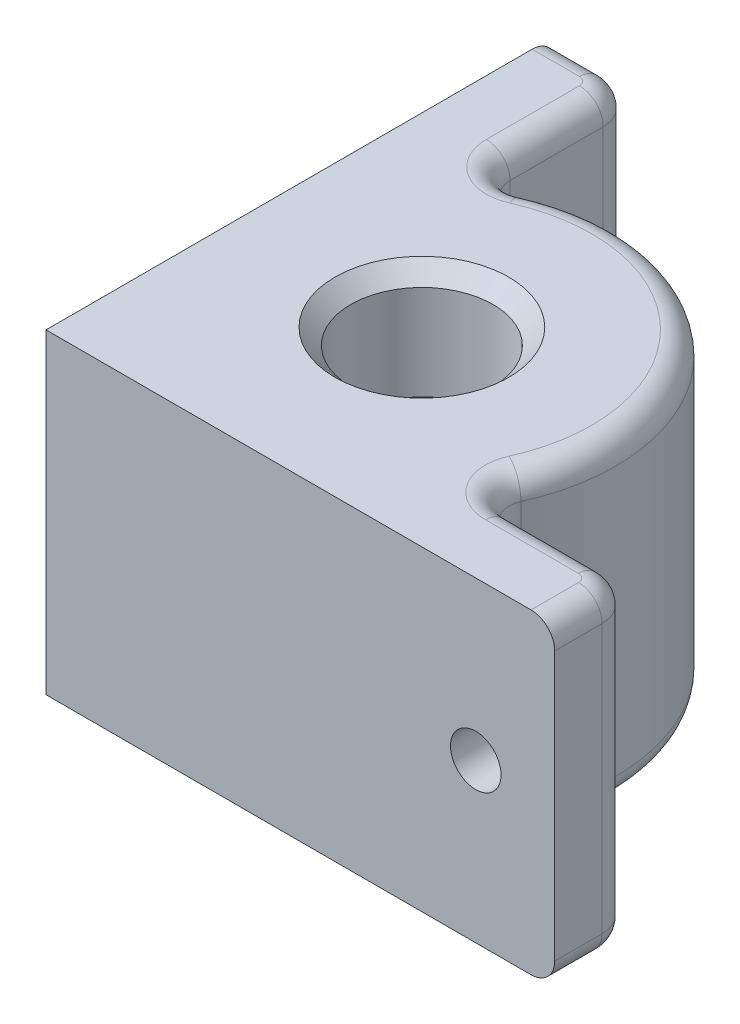
ISO-10303-21;
HEADER;
FILE_DESCRIPTION(('STEP AP214'),'2;1');
FILE_NAME('part.step','',(''),(''),'','','');
FILE_SCHEMA(('AUTOMOTIVE_DESIGN { 1 0 10303 214 1 1 1 1 }'));
ENDSEC;
DATA;
#1=APPLICATION_CONTEXT('core data for automotive mechanical design processes');
#2=APPLICATION_PROTOCOL_DEFINITION('international standard','automotive_design',2000,#1);
#3=PRODUCT_CONTEXT('',#1,'mechanical');
#4=PRODUCT('Part','Part','',(#3));
#5=PRODUCT_RELATED_PRODUCT_CATEGORY('part','',(#4));
#6=PRODUCT_DEFINITION_FORMATION('','',#4);
#7=PRODUCT_DEFINITION_CONTEXT('part definition',#1,'design');
#8=PRODUCT_DEFINITION('design','',#6,#7);
#9=PRODUCT_DEFINITION_SHAPE('','',#8);
#10=(LENGTH_UNIT() NAMED_UNIT(*) SI_UNIT(.MILLI.,.METRE.));
#11=(NAMED_UNIT(*) PLANE_ANGLE_UNIT() SI_UNIT($,.RADIAN.));
#12=(NAMED_UNIT(*) SI_UNIT($,.STERADIAN.) SOLID_ANGLE_UNIT());
#13=UNCERTAINTY_MEASURE_WITH_UNIT(LENGTH_MEASURE(1.E-05),#10,'distance_accuracy_value','');
#14=(GEOMETRIC_REPRESENTATION_CONTEXT(3) GLOBAL_UNCERTAINTY_ASSIGNED_CONTEXT((#13)) GLOBAL_UNIT_ASSIGNED_CONTEXT((#10,
#11,#12)) REPRESENTATION_CONTEXT('',''));
#15=CARTESIAN_POINT('',(0.,0.,0.));
#16=DIRECTION('',(0.,0.,1.));
#17=DIRECTION('',(1.,0.,0.));
#18=AXIS2_PLACEMENT_3D('',#15,#16,#17);
#19=CARTESIAN_POINT('',(60.9000153000318,180.020000000011,127.275000042648));
#20=DIRECTION('',(1.,0.,0.));
#21=DIRECTION('',(0.,0.,1.));
#22=AXIS2_PLACEMENT_3D('',#19,#20,#21);
#23=CYLINDRICAL_SURFACE('',#22,1.5);
#24=CARTESIAN_POINT('',(53.4000204000405,180.020000000011,127.275000042648));
#25=DIRECTION('',(1.,0.,0.));
#26=DIRECTION('',(0.,0.,1.));
#27=AXIS2_PLACEMENT_3D('',#24,#25,#26);
#28=CIRCLE('',#27,1.5);
#29=CARTESIAN_POINT('',(53.4000204000405,180.020000000011,125.775000042648));
#30=VERTEX_POINT('',#29);
#31=CARTESIAN_POINT('',(53.4000204000405,181.520000000011,127.275000042648));
#32=VERTEX_POINT('',#31);
#33=EDGE_CURVE('E562',#30,#32,#28,.T.);
#34=ORIENTED_EDGE('',*,*,#33,.T.);
#35=DIRECTION('',(1.,0.,0.));
#36=VECTOR('',#35,1.);
#37=CARTESIAN_POINT('',(60.9000153000319,181.520000000011,127.275000042648));
#38=LINE('',#37,#36);
#39=CARTESIAN_POINT('',(56.4000204000406,181.520000000011,127.275000042648));
#40=VERTEX_POINT('',#39);
#41=EDGE_CURVE('E66',#32,#40,#38,.T.);
#42=ORIENTED_EDGE('',*,*,#41,.T.);
#43=CARTESIAN_POINT('',(56.4000204000405,180.020000000011,127.275000042648));
#44=DIRECTION('',(-1.,0.,0.));
#45=DIRECTION('',(0.,0.,1.));
#46=AXIS2_PLACEMENT_3D('',#43,#44,#45);
#47=CIRCLE('',#46,1.49999999999999);
#48=CARTESIAN_POINT('',(56.4000204000405,180.020000000011,125.775000042648));
#49=VERTEX_POINT('',#48);
#50=EDGE_CURVE('E565',#40,#49,#47,.T.);
#51=ORIENTED_EDGE('',*,*,#50,.T.);
#52=DIRECTION('',(-1.,0.,0.));
#53=VECTOR('',#52,1.);
#54=CARTESIAN_POINT('',(60.9000153000318,180.020000000011,125.775000042648));
#55=LINE('',#54,#53);
#56=EDGE_CURVE('E523',#49,#30,#55,.T.);
#57=ORIENTED_EDGE('',*,*,#56,.T.);
#58=EDGE_LOOP('',(#34,#42,#51,#57));
#59=FACE_BOUND('',#58,.T.);
#60=ADVANCED_FACE('F55',(#59),#23,.T.);
#61=CARTESIAN_POINT('',(56.4000204000405,180.020000000011,127.775000042648));
#62=DIRECTION('',(0.,-1.,0.));
#63=DIRECTION('',(-1.,0.,0.));
#64=AXIS2_PLACEMENT_3D('',#61,#62,#63);
#65=DEGENERATE_TOROIDAL_SURFACE('',#64,0.5,1.5,.T.);
#66=CARTESIAN_POINT('',(56.9000204000405,180.020000000011,127.775000042648));
#67=DIRECTION('',(0.,0.,-1.));
#68=DIRECTION('',(0.,-1.,0.));
#69=AXIS2_PLACEMENT_3D('',#66,#67,#68);
#70=CIRCLE('',#69,1.49999999999999);
#71=CARTESIAN_POINT('',(56.9000204000406,181.520000000011,127.775000042648));
#72=VERTEX_POINT('',#71);
#73=CARTESIAN_POINT('',(58.4000204000405,180.020000000011,127.775000042648));
#74=VERTEX_POINT('',#73);
#75=EDGE_CURVE('E513',#72,#74,#70,.T.);
#76=ORIENTED_EDGE('',*,*,#75,.T.);
#77=CARTESIAN_POINT('',(56.4000204000405,180.020000000011,127.775000042648));
#78=DIRECTION('',(0.,1.,0.));
#79=DIRECTION('',(1.,0.,0.));
#80=AXIS2_PLACEMENT_3D('',#77,#78,#79);
#81=CIRCLE('',#80,2.);
#82=EDGE_CURVE('E524',#74,#49,#81,.T.);
#83=ORIENTED_EDGE('',*,*,#82,.T.);
#84=ORIENTED_EDGE('',*,*,#50,.F.);
#85=CARTESIAN_POINT('',(56.4000204000406,181.520000000011,127.775000042648));
#86=DIRECTION('',(0.,-1.,0.));
#87=DIRECTION('',(-1.,0.,0.));
#88=AXIS2_PLACEMENT_3D('',#85,#86,#87);
#89=CIRCLE('',#88,0.5);
#90=EDGE_CURVE('E2397',#40,#72,#89,.T.);
#91=ORIENTED_EDGE('',*,*,#90,.T.);
#92=EDGE_LOOP('',(#76,#83,#84,#91));
#93=FACE_BOUND('',#92,.T.);
#94=ADVANCED_FACE('F1999',(#93),#65,.T.);
#95=CARTESIAN_POINT('',(56.9000204000405,180.020000000011,136.697927492911));
#96=DIRECTION('',(0.,0.,1.));
#97=DIRECTION('',(1.,0.,0.));
#98=AXIS2_PLACEMENT_3D('',#95,#96,#97);
#99=CYLINDRICAL_SURFACE('',#98,1.5);
#100=CARTESIAN_POINT('',(56.9000204000405,180.020000000011,133.67116289345));
#101=DIRECTION('',(0.,0.,-1.));
#102=DIRECTION('',(0.,-1.,0.));
#103=AXIS2_PLACEMENT_3D('',#100,#101,#102);
#104=CIRCLE('',#103,1.49999999999999);
#105=CARTESIAN_POINT('',(56.9000204000405,181.520000000011,133.67116289345));
#106=VERTEX_POINT('',#105);
#107=CARTESIAN_POINT('',(58.4000204000405,180.020000000011,133.67116289345));
#108=VERTEX_POINT('',#107);
#109=EDGE_CURVE('E2401',#106,#108,#104,.T.);
#110=ORIENTED_EDGE('',*,*,#109,.T.);
#111=DIRECTION('',(0.,0.,-1.));
#112=VECTOR('',#111,1.);
#113=CARTESIAN_POINT('',(58.4000204000405,180.020000000011,136.697927492911));
#114=LINE('',#113,#112);
#115=EDGE_CURVE('E2409',#108,#74,#114,.T.);
#116=ORIENTED_EDGE('',*,*,#115,.T.);
#117=ORIENTED_EDGE('',*,*,#75,.F.);
#118=DIRECTION('',(0.,0.,1.));
#119=VECTOR('',#118,1.);
#120=CARTESIAN_POINT('',(56.9000204000405,181.520000000011,136.697927492911));
#121=LINE('',#120,#119);
#122=EDGE_CURVE('E507',#72,#106,#121,.T.);
#123=ORIENTED_EDGE('',*,*,#122,.T.);
#124=EDGE_LOOP('',(#110,#116,#117,#123));
#125=FACE_BOUND('',#124,.T.);
#126=ADVANCED_FACE('F2012',(#125),#99,.T.);
#127=CARTESIAN_POINT('',(59.9000204000405,180.020000000011,133.67116289345));
#128=DIRECTION('',(0.,1.,0.));
#129=DIRECTION('',(1.,0.,0.));
#130=AXIS2_PLACEMENT_3D('',#127,#128,#129);
#131=TOROIDAL_SURFACE('',#130,3.,1.5);
#132=CARTESIAN_POINT('',(61.1222380889217,180.020000000011,136.410904472685));
#133=DIRECTION('',(-0.913247193078141,0.,0.407405896293728));
#134=DIRECTION('',(0.,1.,0.));
#135=AXIS2_PLACEMENT_3D('',#132,#133,#134);
#136=CIRCLE('',#135,1.49999999999999);
#137=CARTESIAN_POINT('',(61.1222380889218,181.520000000011,136.410904472685));
#138=VERTEX_POINT('',#137);
#139=CARTESIAN_POINT('',(60.5111292444811,180.020000000011,135.041033683068));
#140=VERTEX_POINT('',#139);
#141=EDGE_CURVE('E502',#138,#140,#136,.T.);
#142=ORIENTED_EDGE('',*,*,#141,.T.);
#143=CARTESIAN_POINT('',(59.9000204000405,180.020000000011,133.67116289345));
#144=DIRECTION('',(0.,-1.,0.));
#145=DIRECTION('',(-1.,0.,0.));
#146=AXIS2_PLACEMENT_3D('',#143,#144,#145);
#147=CIRCLE('',#146,1.5);
#148=EDGE_CURVE('E498',#140,#108,#147,.T.);
#149=ORIENTED_EDGE('',*,*,#148,.T.);
#150=ORIENTED_EDGE('',*,*,#109,.F.);
#151=CARTESIAN_POINT('',(59.9000204000406,181.520000000011,133.67116289345));
#152=DIRECTION('',(0.,1.,0.));
#153=DIRECTION('',(1.,0.,0.));
#154=AXIS2_PLACEMENT_3D('',#151,#152,#153);
#155=CIRCLE('',#154,3.);
#156=EDGE_CURVE('E490',#106,#138,#155,.T.);
#157=ORIENTED_EDGE('',*,*,#156,.T.);
#158=EDGE_LOOP('',(#142,#149,#150,#157));
#159=FACE_BOUND('',#158,.T.);
#160=ADVANCED_FACE('F2022',(#159),#131,.T.);
#161=CARTESIAN_POINT('',(65.4000000000058,180.020000000011,146.000000000005));
#162=DIRECTION('',(0.,-1.,0.));
#163=DIRECTION('',(-1.,0.,0.));
#164=AXIS2_PLACEMENT_3D('',#161,#162,#163);
#165=TOROIDAL_SURFACE('',#164,10.5,1.5);
#166=CARTESIAN_POINT('',(74.9751488895736,180.02000000001,150.30888892206));
#167=DIRECTION('',(0.410370373529056,0.,-0.911918941863597));
#168=DIRECTION('',(0.,-1.,0.));
#169=AXIS2_PLACEMENT_3D('',#166,#167,#168);
#170=CIRCLE('',#169,1.49999999999999);
#171=CARTESIAN_POINT('',(74.9751488895736,181.52000000001,150.30888892206));
#172=VERTEX_POINT('',#171);
#173=CARTESIAN_POINT('',(76.343027302369,180.02000000001,150.924444482354));
#174=VERTEX_POINT('',#173);
#175=EDGE_CURVE('E485',#172,#174,#170,.T.);
#176=ORIENTED_EDGE('',*,*,#175,.T.);
#177=CARTESIAN_POINT('',(65.4000000000058,180.020000000011,146.000000000005));
#178=DIRECTION('',(0.,1.,0.));
#179=DIRECTION('',(1.,0.,0.));
#180=AXIS2_PLACEMENT_3D('',#177,#178,#179);
#181=CIRCLE('',#180,12.);
#182=EDGE_CURVE('E488',#174,#140,#181,.T.);
#183=ORIENTED_EDGE('',*,*,#182,.T.);
#184=ORIENTED_EDGE('',*,*,#141,.F.);
#185=CARTESIAN_POINT('',(65.4000000000059,181.520000000011,146.000000000005));
#186=DIRECTION('',(0.,-1.,0.));
#187=DIRECTION('',(-1.,0.,0.));
#188=AXIS2_PLACEMENT_3D('',#185,#186,#187);
#189=CIRCLE('',#188,10.5);
#190=EDGE_CURVE('E473',#138,#172,#189,.T.);
#191=ORIENTED_EDGE('',*,*,#190,.T.);
#192=EDGE_LOOP('',(#176,#183,#184,#191));
#193=FACE_BOUND('',#192,.T.);
#194=ADVANCED_FACE('F2037',(#193),#165,.T.);
#195=CARTESIAN_POINT('',(77.7109057151644,180.02000000001,151.540000042648));
#196=DIRECTION('',(0.,1.,0.));
#197=DIRECTION('',(1.,0.,0.));
#198=AXIS2_PLACEMENT_3D('',#195,#196,#197);
#199=TOROIDAL_SURFACE('',#198,3.,1.5);
#200=CARTESIAN_POINT('',(77.7109057151644,180.02000000001,154.540000042648));
#201=DIRECTION('',(-1.,0.,0.));
#202=DIRECTION('',(0.,0.,1.));
#203=AXIS2_PLACEMENT_3D('',#200,#201,#202);
#204=CIRCLE('',#203,1.49999999999999);
#205=CARTESIAN_POINT('',(77.7109057151644,181.52000000001,154.540000042648));
#206=VERTEX_POINT('',#205);
#207=CARTESIAN_POINT('',(77.7109057151644,180.02000000001,153.040000042648));
#208=VERTEX_POINT('',#207);
#209=EDGE_CURVE('E461',#206,#208,#204,.T.);
#210=ORIENTED_EDGE('',*,*,#209,.T.);
#211=CARTESIAN_POINT('',(77.7109057151644,180.02000000001,151.540000042648));
#212=DIRECTION('',(0.,-1.,0.));
#213=DIRECTION('',(-1.,0.,0.));
#214=AXIS2_PLACEMENT_3D('',#211,#212,#213);
#215=CIRCLE('',#214,1.5);
#216=EDGE_CURVE('E472',#208,#174,#215,.T.);
#217=ORIENTED_EDGE('',*,*,#216,.T.);
#218=ORIENTED_EDGE('',*,*,#175,.F.);
#219=CARTESIAN_POINT('',(77.7109057151644,181.52000000001,151.540000042648));
#220=DIRECTION('',(0.,1.,0.));
#221=DIRECTION('',(1.,0.,0.));
#222=AXIS2_PLACEMENT_3D('',#219,#220,#221);
#223=CIRCLE('',#222,3.);
#224=EDGE_CURVE('E1848',#172,#206,#223,.T.);
#225=ORIENTED_EDGE('',*,*,#224,.T.);
#226=EDGE_LOOP('',(#210,#217,#218,#225));
#227=FACE_BOUND('',#226,.T.);
#228=ADVANCED_FACE('F2047',(#227),#199,.T.);
#229=CARTESIAN_POINT('',(71.3541716694838,180.020000000011,154.540000042648));
#230=DIRECTION('',(1.,0.,0.));
#231=DIRECTION('',(0.,0.,1.));
#232=AXIS2_PLACEMENT_3D('',#229,#230,#231);
#233=CYLINDRICAL_SURFACE('',#232,1.5);
#234=CARTESIAN_POINT('',(83.5980204000405,180.02000000001,154.540000042648));
#235=DIRECTION('',(-1.,0.,0.));
#236=DIRECTION('',(0.,0.,1.));
#237=AXIS2_PLACEMENT_3D('',#234,#235,#236);
#238=CIRCLE('',#237,1.49999999999999);
#239=CARTESIAN_POINT('',(83.5980204000406,181.52000000001,154.540000042648));
#240=VERTEX_POINT('',#239);
#241=CARTESIAN_POINT('',(83.5980204000405,180.02000000001,153.040000042648));
#242=VERTEX_POINT('',#241);
#243=EDGE_CURVE('E1826',#240,#242,#238,.T.);
#244=ORIENTED_EDGE('',*,*,#243,.T.);
#245=DIRECTION('',(-1.,0.,0.));
#246=VECTOR('',#245,1.);
#247=CARTESIAN_POINT('',(71.3541716694838,180.020000000011,153.040000042648));
#248=LINE('',#247,#246);
#249=EDGE_CURVE('E1838',#242,#208,#248,.T.);
#250=ORIENTED_EDGE('',*,*,#249,.T.);
#251=ORIENTED_EDGE('',*,*,#209,.F.);
#252=DIRECTION('',(1.,0.,0.));
#253=VECTOR('',#252,1.);
#254=CARTESIAN_POINT('',(71.3541716694838,181.520000000011,154.540000042648));
#255=LINE('',#254,#253);
#256=EDGE_CURVE('E453',#206,#240,#255,.T.);
#257=ORIENTED_EDGE('',*,*,#256,.T.);
#258=EDGE_LOOP('',(#244,#250,#251,#257));
#259=FACE_BOUND('',#258,.T.);
#260=ADVANCED_FACE('F1842',(#259),#233,.T.);
#261=CARTESIAN_POINT('',(83.5980204000405,180.02000000001,155.040000042648));
#262=DIRECTION('',(0.,-1.,0.));
#263=DIRECTION('',(-1.,0.,0.));
#264=AXIS2_PLACEMENT_3D('',#261,#262,#263);
#265=DEGENERATE_TOROIDAL_SURFACE('',#264,0.5,1.5,.T.);
#266=CARTESIAN_POINT('',(84.0980204000405,180.02000000001,155.040000042648));
#267=DIRECTION('',(0.,0.,-1.));
#268=DIRECTION('',(0.,-1.,0.));
#269=AXIS2_PLACEMENT_3D('',#266,#267,#268);
#270=CIRCLE('',#269,1.49999999999995);
#271=CARTESIAN_POINT('',(84.0980204000406,181.52000000001,155.040000042648));
#272=VERTEX_POINT('',#271);
#273=CARTESIAN_POINT('',(85.5980204000405,180.02000000001,155.040000042648));
#274=VERTEX_POINT('',#273);
#275=EDGE_CURVE('E448',#272,#274,#270,.T.);
#276=ORIENTED_EDGE('',*,*,#275,.T.);
#277=CARTESIAN_POINT('',(83.5980204000405,180.02000000001,155.040000042648));
#278=DIRECTION('',(0.,1.,0.));
#279=DIRECTION('',(1.,0.,0.));
#280=AXIS2_PLACEMENT_3D('',#277,#278,#279);
#281=CIRCLE('',#280,2.);
#282=EDGE_CURVE('E454',#274,#242,#281,.T.);
#283=ORIENTED_EDGE('',*,*,#282,.T.);
#284=ORIENTED_EDGE('',*,*,#243,.F.);
#285=CARTESIAN_POINT('',(83.5980204000406,181.52000000001,155.040000042648));
#286=DIRECTION('',(0.,-1.,0.));
#287=DIRECTION('',(-1.,0.,0.));
#288=AXIS2_PLACEMENT_3D('',#285,#286,#287);
#289=CIRCLE('',#288,0.5);
#290=EDGE_CURVE('E1812',#240,#272,#289,.T.);
#291=ORIENTED_EDGE('',*,*,#290,.T.);
#292=EDGE_LOOP('',(#276,#283,#284,#291));
#293=FACE_BOUND('',#292,.T.);
#294=ADVANCED_FACE('F1827',(#293),#265,.T.);
#295=CARTESIAN_POINT('',(84.0980204000405,180.02000000001,148.540000042648));
#296=DIRECTION('',(0.,0.,1.));
#297=DIRECTION('',(1.,0.,0.));
#298=AXIS2_PLACEMENT_3D('',#295,#296,#297);
#299=CYLINDRICAL_SURFACE('',#298,1.5);
#300=DIRECTION('',(0.,0.,-1.));
#301=VECTOR('',#300,1.);
#302=CARTESIAN_POINT('',(85.5980204000405,180.02000000001,148.540000042648));
#303=LINE('',#302,#301);
#304=CARTESIAN_POINT('',(85.5980204000405,180.02000000001,158.040000042648));
#305=VERTEX_POINT('',#304);
#306=EDGE_CURVE('E380',#305,#274,#303,.T.);
#307=ORIENTED_EDGE('',*,*,#306,.T.);
#308=ORIENTED_EDGE('',*,*,#275,.F.);
#309=DIRECTION('',(0.,0.,1.));
#310=VECTOR('',#309,1.);
#311=CARTESIAN_POINT('',(84.0980204000405,181.52000000001,148.540000042648));
#312=LINE('',#311,#310);
#313=CARTESIAN_POINT('',(84.0980204000405,181.52000000001,158.040000042648));
#314=VERTEX_POINT('',#313);
#315=EDGE_CURVE('E375',#272,#314,#312,.T.);
#316=ORIENTED_EDGE('',*,*,#315,.T.);
#317=CARTESIAN_POINT('',(84.0980204000405,180.02000000001,158.040000042648));
#318=DIRECTION('',(0.,0.,-1.));
#319=DIRECTION('',(-1.,0.,0.));
#320=AXIS2_PLACEMENT_3D('',#317,#318,#319);
#321=CIRCLE('',#320,1.5);
#322=EDGE_CURVE('E1807',#314,#305,#321,.T.);
#323=ORIENTED_EDGE('',*,*,#322,.T.);
#324=EDGE_LOOP('',(#307,#308,#316,#323));
#325=FACE_BOUND('',#324,.T.);
#326=ADVANCED_FACE('F2081',(#325),#299,.T.);
#327=CARTESIAN_POINT('',(53.4000204000403,173.520000000011,125.775000042648));
#328=DIRECTION('',(0.,0.,-1.));
#329=DIRECTION('',(0.,1.,0.));
#330=AXIS2_PLACEMENT_3D('',#327,#328,#329);
#331=PLANE('',#330);
#332=ORIENTED_EDGE('',*,*,#56,.F.);
#333=DIRECTION('',(0.,1.,0.));
#334=VECTOR('',#333,1.);
#335=CARTESIAN_POINT('',(56.4000204000402,172.520000000011,125.775000042648));
#336=LINE('',#335,#334);
#337=CARTESIAN_POINT('',(56.4000204000399,163.020000000011,125.775000042647));
#338=VERTEX_POINT('',#337);
#339=EDGE_CURVE('E381',#338,#49,#336,.T.);
#340=ORIENTED_EDGE('',*,*,#339,.F.);
#341=DIRECTION('',(1.,0.,0.));
#342=VECTOR('',#341,1.);
#343=CARTESIAN_POINT('',(60.9000153000312,163.020000000011,125.775000042647));
#344=LINE('',#343,#342);
#345=CARTESIAN_POINT('',(53.4000204000399,163.020000000011,125.775000042647));
#346=VERTEX_POINT('',#345);
#347=EDGE_CURVE('E387',#346,#338,#344,.T.);
#348=ORIENTED_EDGE('',*,*,#347,.F.);
#349=DIRECTION('',(0.,-1.,0.));
#350=VECTOR('',#349,1.);
#351=CARTESIAN_POINT('',(53.4000204000403,173.520000000011,125.775000042647));
#352=LINE('',#351,#350);
#353=EDGE_CURVE('E394',#30,#346,#352,.T.);
#354=ORIENTED_EDGE('',*,*,#353,.F.);
#355=EDGE_LOOP('',(#332,#340,#348,#354));
#356=FACE_BOUND('',#355,.T.);
#357=ADVANCED_FACE('F2095',(#356),#331,.T.);
#358=CARTESIAN_POINT('',(56.4000204000402,172.520000000011,127.775000042647));
#359=DIRECTION('',(0.,1.,0.));
#360=DIRECTION('',(1.,0.,0.));
#361=AXIS2_PLACEMENT_3D('',#358,#359,#360);
#362=CYLINDRICAL_SURFACE('',#361,2.);
#363=ORIENTED_EDGE('',*,*,#82,.F.);
#364=DIRECTION('',(0.,-1.,0.));
#365=VECTOR('',#364,1.);
#366=CARTESIAN_POINT('',(58.4000204000402,172.520000000011,127.775000042647));
#367=LINE('',#366,#365);
#368=CARTESIAN_POINT('',(58.4000204000399,163.020000000011,127.775000042647));
#369=VERTEX_POINT('',#368);
#370=EDGE_CURVE('E378',#74,#369,#367,.T.);
#371=ORIENTED_EDGE('',*,*,#370,.T.);
#372=CARTESIAN_POINT('',(56.4000204000399,163.020000000011,127.775000042647));
#373=DIRECTION('',(0.,-1.,0.));
#374=DIRECTION('',(-1.,0.,0.));
#375=AXIS2_PLACEMENT_3D('',#372,#373,#374);
#376=CIRCLE('',#375,2.);
#377=EDGE_CURVE('E400',#338,#369,#376,.T.);
#378=ORIENTED_EDGE('',*,*,#377,.F.);
#379=ORIENTED_EDGE('',*,*,#339,.T.);
#380=EDGE_LOOP('',(#363,#371,#378,#379));
#381=FACE_BOUND('',#380,.T.);
#382=ADVANCED_FACE('F2105',(#381),#362,.T.);
#383=CARTESIAN_POINT('',(58.4000204000402,171.520000000011,130.355854943175));
#384=DIRECTION('',(1.,0.,0.));
#385=DIRECTION('',(0.,1.,0.));
#386=AXIS2_PLACEMENT_3D('',#383,#384,#385);
#387=PLANE('',#386);
#388=ORIENTED_EDGE('',*,*,#115,.F.);
#389=DIRECTION('',(0.,1.,0.));
#390=VECTOR('',#389,1.);
#391=CARTESIAN_POINT('',(58.4000204000403,173.520000000011,133.67116289345));
#392=LINE('',#391,#390);
#393=CARTESIAN_POINT('',(58.4000204000399,163.020000000011,133.67116289345));
#394=VERTEX_POINT('',#393);
#395=EDGE_CURVE('E403',#394,#108,#392,.T.);
#396=ORIENTED_EDGE('',*,*,#395,.F.);
#397=DIRECTION('',(0.,0.,1.));
#398=VECTOR('',#397,1.);
#399=CARTESIAN_POINT('',(58.4000204000399,163.020000000011,136.697927492911));
#400=LINE('',#399,#398);
#401=EDGE_CURVE('E413',#369,#394,#400,.T.);
#402=ORIENTED_EDGE('',*,*,#401,.F.);
#403=ORIENTED_EDGE('',*,*,#370,.F.);
#404=EDGE_LOOP('',(#388,#396,#402,#403));
#405=FACE_BOUND('',#404,.T.);
#406=CARTESIAN_POINT('',(58.4000204000402,171.520000000011,130.775014209364));
#407=DIRECTION('',(-1.,0.,0.));
#408=DIRECTION('',(0.,0.,1.));
#409=AXIS2_PLACEMENT_3D('',#406,#407,#408);
#410=CIRCLE('',#409,1.6);
#411=CARTESIAN_POINT('',(58.4000204000402,171.520000000011,132.375014209364));
#412=VERTEX_POINT('',#411);
#413=EDGE_CURVE('E384',#412,#412,#410,.T.);
#414=ORIENTED_EDGE('',*,*,#413,.T.);
#415=EDGE_LOOP('',(#414));
#416=FACE_BOUND('',#415,.T.);
#417=ADVANCED_FACE('F2118',(#405,#416),#387,.T.);
#418=CARTESIAN_POINT('',(59.9000204000403,173.520000000011,133.67116289345));
#419=DIRECTION('',(0.,-1.,0.));
#420=DIRECTION('',(-1.,0.,0.));
#421=AXIS2_PLACEMENT_3D('',#418,#419,#420);
#422=CYLINDRICAL_SURFACE('',#421,1.5);
#423=ORIENTED_EDGE('',*,*,#148,.F.);
#424=DIRECTION('',(0.,-1.,0.));
#425=VECTOR('',#424,1.);
#426=CARTESIAN_POINT('',(60.5111292444809,173.520000000011,135.041033683067));
#427=LINE('',#426,#425);
#428=CARTESIAN_POINT('',(60.5111292444805,163.020000000011,135.041033683067));
#429=VERTEX_POINT('',#428);
#430=EDGE_CURVE('E410',#140,#429,#427,.T.);
#431=ORIENTED_EDGE('',*,*,#430,.T.);
#432=CARTESIAN_POINT('',(59.9000204000399,163.020000000011,133.67116289345));
#433=DIRECTION('',(0.,1.,0.));
#434=DIRECTION('',(1.,0.,0.));
#435=AXIS2_PLACEMENT_3D('',#432,#433,#434);
#436=CIRCLE('',#435,1.5);
#437=EDGE_CURVE('E1878',#394,#429,#436,.T.);
#438=ORIENTED_EDGE('',*,*,#437,.F.);
#439=ORIENTED_EDGE('',*,*,#395,.T.);
#440=EDGE_LOOP('',(#423,#431,#438,#439));
#441=FACE_BOUND('',#440,.T.);
#442=ADVANCED_FACE('F2126',(#441),#422,.F.);
#443=CARTESIAN_POINT('',(65.4000000000056,173.520000000011,146.000000000005));
#444=DIRECTION('',(0.,-1.,0.));
#445=DIRECTION('',(-1.,0.,0.));
#446=AXIS2_PLACEMENT_3D('',#443,#444,#445);
#447=CYLINDRICAL_SURFACE('',#446,12.);
#448=ORIENTED_EDGE('',*,*,#182,.F.);
#449=DIRECTION('',(0.,1.,0.));
#450=VECTOR('',#449,1.);
#451=CARTESIAN_POINT('',(76.3430273023687,173.52000000001,150.924444482354));
#452=LINE('',#451,#450);
#453=CARTESIAN_POINT('',(76.3430273023684,163.02000000001,150.924444482354));
#454=VERTEX_POINT('',#453);
#455=EDGE_CURVE('E347',#454,#174,#452,.T.);
#456=ORIENTED_EDGE('',*,*,#455,.F.);
#457=CARTESIAN_POINT('',(65.4000000000052,163.020000000011,146.000000000005));
#458=DIRECTION('',(0.,-1.,0.));
#459=DIRECTION('',(-1.,0.,0.));
#460=AXIS2_PLACEMENT_3D('',#457,#458,#459);
#461=CIRCLE('',#460,12.);
#462=EDGE_CURVE('E1874',#429,#454,#461,.T.);
#463=ORIENTED_EDGE('',*,*,#462,.F.);
#464=ORIENTED_EDGE('',*,*,#430,.F.);
#465=EDGE_LOOP('',(#448,#456,#463,#464));
#466=FACE_BOUND('',#465,.T.);
#467=ADVANCED_FACE('F2139',(#466),#447,.T.);
#468=CARTESIAN_POINT('',(77.7109057151641,173.52000000001,151.540000042648));
#469=DIRECTION('',(0.,-1.,0.));
#470=DIRECTION('',(-1.,0.,0.));
#471=AXIS2_PLACEMENT_3D('',#468,#469,#470);
#472=CYLINDRICAL_SURFACE('',#471,1.5);
#473=ORIENTED_EDGE('',*,*,#216,.F.);
#474=DIRECTION('',(0.,-1.,0.));
#475=VECTOR('',#474,1.);
#476=CARTESIAN_POINT('',(77.7109057151641,173.52000000001,153.040000042648));
#477=LINE('',#476,#475);
#478=CARTESIAN_POINT('',(77.7109057151638,163.02000000001,153.040000042647));
#479=VERTEX_POINT('',#478);
#480=EDGE_CURVE('E406',#208,#479,#477,.T.);
#481=ORIENTED_EDGE('',*,*,#480,.T.);
#482=CARTESIAN_POINT('',(77.7109057151638,163.02000000001,151.540000042647));
#483=DIRECTION('',(0.,1.,0.));
#484=DIRECTION('',(1.,0.,0.));
#485=AXIS2_PLACEMENT_3D('',#482,#483,#484);
#486=CIRCLE('',#485,1.5);
#487=EDGE_CURVE('E338',#454,#479,#486,.T.);
#488=ORIENTED_EDGE('',*,*,#487,.F.);
#489=ORIENTED_EDGE('',*,*,#455,.T.);
#490=EDGE_LOOP('',(#473,#481,#488,#489));
#491=FACE_BOUND('',#490,.T.);
#492=ADVANCED_FACE('F1866',(#491),#472,.F.);
#493=CARTESIAN_POINT('',(74.3083331389442,173.520000000011,153.040000042648));
#494=DIRECTION('',(0.,0.,-1.));
#495=DIRECTION('',(0.,1.,0.));
#496=AXIS2_PLACEMENT_3D('',#493,#494,#495);
#497=PLANE('',#496);
#498=CARTESIAN_POINT('',(80.5981426744383,171.52000000001,153.040000042648));
#499=DIRECTION('',(0.,0.,-1.));
#500=DIRECTION('',(-1.,0.,0.));
#501=AXIS2_PLACEMENT_3D('',#498,#499,#500);
#502=CIRCLE('',#501,1.6);
#503=CARTESIAN_POINT('',(78.9981426744383,171.52000000001,153.040000042648));
#504=VERTEX_POINT('',#503);
#505=EDGE_CURVE('E327',#504,#504,#502,.T.);
#506=ORIENTED_EDGE('',*,*,#505,.F.);
#507=EDGE_LOOP('',(#506));
#508=FACE_BOUND('',#507,.T.);
#509=ORIENTED_EDGE('',*,*,#249,.F.);
#510=DIRECTION('',(0.,1.,0.));
#511=VECTOR('',#510,1.);
#512=CARTESIAN_POINT('',(83.5980204000403,173.52000000001,153.040000042648));
#513=LINE('',#512,#511);
#514=CARTESIAN_POINT('',(83.5980204000399,163.02000000001,153.040000042647));
#515=VERTEX_POINT('',#514);
#516=EDGE_CURVE('E337',#515,#242,#513,.T.);
#517=ORIENTED_EDGE('',*,*,#516,.F.);
#518=DIRECTION('',(1.,0.,0.));
#519=VECTOR('',#518,1.);
#520=CARTESIAN_POINT('',(71.3541716694832,163.020000000011,153.040000042647));
#521=LINE('',#520,#519);
#522=EDGE_CURVE('E219',#479,#515,#521,.T.);
#523=ORIENTED_EDGE('',*,*,#522,.F.);
#524=ORIENTED_EDGE('',*,*,#480,.F.);
#525=EDGE_LOOP('',(#509,#517,#523,#524));
#526=FACE_BOUND('',#525,.T.);
#527=ADVANCED_FACE('F1839',(#508,#526),#497,.T.);
#528=CARTESIAN_POINT('',(83.5980204000403,173.52000000001,155.040000042648));
#529=DIRECTION('',(0.,-1.,0.));
#530=DIRECTION('',(-1.,0.,0.));
#531=AXIS2_PLACEMENT_3D('',#528,#529,#530);
#532=CYLINDRICAL_SURFACE('',#531,2.);
#533=ORIENTED_EDGE('',*,*,#282,.F.);
#534=DIRECTION('',(0.,-1.,0.));
#535=VECTOR('',#534,1.);
#536=CARTESIAN_POINT('',(85.5980204000403,173.52000000001,155.040000042648));
#537=LINE('',#536,#535);
#538=CARTESIAN_POINT('',(85.5980204000399,163.02000000001,155.040000042647));
#539=VERTEX_POINT('',#538);
#540=EDGE_CURVE('E343',#274,#539,#537,.T.);
#541=ORIENTED_EDGE('',*,*,#540,.T.);
#542=CARTESIAN_POINT('',(83.5980204000399,163.02000000001,155.040000042647));
#543=DIRECTION('',(0.,-1.,0.));
#544=DIRECTION('',(-1.,0.,0.));
#545=AXIS2_PLACEMENT_3D('',#542,#543,#544);
#546=CIRCLE('',#545,2.);
#547=EDGE_CURVE('E212',#515,#539,#546,.T.);
#548=ORIENTED_EDGE('',*,*,#547,.F.);
#549=ORIENTED_EDGE('',*,*,#516,.T.);
#550=EDGE_LOOP('',(#533,#541,#548,#549));
#551=FACE_BOUND('',#550,.T.);
#552=ADVANCED_FACE('F1847',(#551),#532,.T.);
#553=CARTESIAN_POINT('',(85.5980204000403,173.52000000001,154.040000042648));
#554=DIRECTION('',(1.,0.,0.));
#555=DIRECTION('',(0.,1.,0.));
#556=AXIS2_PLACEMENT_3D('',#553,#554,#555);
#557=PLANE('',#556);
#558=DIRECTION('',(0.,-1.,0.));
#559=VECTOR('',#558,1.);
#560=CARTESIAN_POINT('',(85.5980204000403,173.52000000001,158.040000042648));
#561=LINE('',#560,#559);
#562=CARTESIAN_POINT('',(85.5980204000399,163.02000000001,158.040000042647));
#563=VERTEX_POINT('',#562);
#564=EDGE_CURVE('E344',#305,#563,#561,.T.);
#565=ORIENTED_EDGE('',*,*,#564,.T.);
#566=DIRECTION('',(0.,0.,1.));
#567=VECTOR('',#566,1.);
#568=CARTESIAN_POINT('',(85.5980204000399,163.02000000001,148.540000042647));
#569=LINE('',#568,#567);
#570=EDGE_CURVE('E202',#539,#563,#569,.T.);
#571=ORIENTED_EDGE('',*,*,#570,.F.);
#572=ORIENTED_EDGE('',*,*,#540,.F.);
#573=ORIENTED_EDGE('',*,*,#306,.F.);
#574=EDGE_LOOP('',(#565,#571,#572,#573));
#575=FACE_BOUND('',#574,.T.);
#576=ADVANCED_FACE('F2184',(#575),#557,.T.);
#577=CARTESIAN_POINT('',(83.4000204000403,173.52000000001,158.040000042648));
#578=DIRECTION('',(0.,0.,1.));
#579=DIRECTION('',(0.,-1.,0.));
#580=AXIS2_PLACEMENT_3D('',#577,#578,#579);
#581=PLANE('',#580);
#582=ORIENTED_EDGE('',*,*,#322,.F.);
#583=DIRECTION('',(1.,0.,0.));
#584=VECTOR('',#583,1.);
#585=CARTESIAN_POINT('',(75.9000153000319,181.52000000001,158.040000042648));
#586=LINE('',#585,#584);
#587=CARTESIAN_POINT('',(53.4000204000405,181.520000000011,158.040000042648));
#588=VERTEX_POINT('',#587);
#589=EDGE_CURVE('E358',#588,#314,#586,.T.);
#590=ORIENTED_EDGE('',*,*,#589,.F.);
#591=DIRECTION('',(0.,-1.,0.));
#592=VECTOR('',#591,1.);
#593=CARTESIAN_POINT('',(53.4000204000403,173.520000000011,158.040000042648));
#594=LINE('',#593,#592);
#595=CARTESIAN_POINT('',(53.4000204000399,161.520000000011,158.040000042647));
#596=VERTEX_POINT('',#595);
#597=EDGE_CURVE('E354',#588,#596,#594,.T.);
#598=ORIENTED_EDGE('',*,*,#597,.T.);
#599=DIRECTION('',(-1.,0.,0.));
#600=VECTOR('',#599,1.);
#601=CARTESIAN_POINT('',(75.9000153000312,161.52000000001,158.040000042647));
#602=LINE('',#601,#600);
#603=CARTESIAN_POINT('',(84.0980204000399,161.52000000001,158.040000042647));
#604=VERTEX_POINT('',#603);
#605=EDGE_CURVE('E351',#604,#596,#602,.T.);
#606=ORIENTED_EDGE('',*,*,#605,.F.);
#607=CARTESIAN_POINT('',(84.0980204000399,163.02000000001,158.040000042647));
#608=DIRECTION('',(0.,0.,-1.));
#609=DIRECTION('',(-1.,0.,0.));
#610=AXIS2_PLACEMENT_3D('',#607,#608,#609);
#611=CIRCLE('',#610,1.5);
#612=EDGE_CURVE('E201',#563,#604,#611,.T.);
#613=ORIENTED_EDGE('',*,*,#612,.F.);
#614=ORIENTED_EDGE('',*,*,#564,.F.);
#615=EDGE_LOOP('',(#582,#590,#598,#606,#613,#614));
#616=FACE_BOUND('',#615,.T.);
#617=CARTESIAN_POINT('',(80.5981426744383,171.52000000001,158.040000042648));
#618=DIRECTION('',(0.,0.,1.));
#619=DIRECTION('',(1.,0.,0.));
#620=AXIS2_PLACEMENT_3D('',#617,#618,#619);
#621=CIRCLE('',#620,1.6);
#622=CARTESIAN_POINT('',(82.1981426744384,171.52000000001,158.040000042648));
#623=VERTEX_POINT('',#622);
#624=EDGE_CURVE('E331',#623,#623,#621,.T.);
#625=ORIENTED_EDGE('',*,*,#624,.F.);
#626=EDGE_LOOP('',(#625));
#627=FACE_BOUND('',#626,.T.);
#628=ADVANCED_FACE('F2194',(#616,#627),#581,.T.);
#629=CARTESIAN_POINT('',(60.9000153000312,163.020000000011,127.275000042647));
#630=DIRECTION('',(1.,0.,0.));
#631=DIRECTION('',(0.,0.,1.));
#632=AXIS2_PLACEMENT_3D('',#629,#630,#631);
#633=CYLINDRICAL_SURFACE('',#632,1.5);
#634=CARTESIAN_POINT('',(53.4000204000399,163.020000000011,127.275000042647));
#635=DIRECTION('',(1.,0.,0.));
#636=DIRECTION('',(0.,0.,1.));
#637=AXIS2_PLACEMENT_3D('',#634,#635,#636);
#638=CIRCLE('',#637,1.5);
#639=CARTESIAN_POINT('',(53.4000204000399,161.520000000011,127.275000042647));
#640=VERTEX_POINT('',#639);
#641=EDGE_CURVE('E388',#640,#346,#638,.T.);
#642=ORIENTED_EDGE('',*,*,#641,.T.);
#643=ORIENTED_EDGE('',*,*,#347,.T.);
#644=CARTESIAN_POINT('',(56.4000204000399,163.020000000011,127.275000042647));
#645=DIRECTION('',(-1.,0.,0.));
#646=DIRECTION('',(0.,0.,1.));
#647=AXIS2_PLACEMENT_3D('',#644,#645,#646);
#648=CIRCLE('',#647,1.5);
#649=CARTESIAN_POINT('',(56.4000204000399,161.520000000011,127.275000042647));
#650=VERTEX_POINT('',#649);
#651=EDGE_CURVE('E393',#338,#650,#648,.T.);
#652=ORIENTED_EDGE('',*,*,#651,.T.);
#653=DIRECTION('',(-1.,0.,0.));
#654=VECTOR('',#653,1.);
#655=CARTESIAN_POINT('',(60.9000153000312,161.520000000011,127.275000042647));
#656=LINE('',#655,#654);
#657=EDGE_CURVE('E2576',#650,#640,#656,.T.);
#658=ORIENTED_EDGE('',*,*,#657,.T.);
#659=EDGE_LOOP('',(#642,#643,#652,#658));
#660=FACE_BOUND('',#659,.T.);
#661=ADVANCED_FACE('F2209',(#660),#633,.T.);
#662=CARTESIAN_POINT('',(56.4000204000399,163.020000000011,127.775000042647));
#663=DIRECTION('',(0.,1.,0.));
#664=DIRECTION('',(1.,0.,0.));
#665=AXIS2_PLACEMENT_3D('',#662,#663,#664);
#666=DEGENERATE_TOROIDAL_SURFACE('',#665,0.5,1.5,.T.);
#667=CARTESIAN_POINT('',(56.9000204000399,163.020000000011,127.775000042647));
#668=DIRECTION('',(0.,0.,-1.));
#669=DIRECTION('',(0.,-1.,0.));
#670=AXIS2_PLACEMENT_3D('',#667,#668,#669);
#671=CIRCLE('',#670,1.5);
#672=CARTESIAN_POINT('',(56.9000204000399,161.520000000011,127.775000042647));
#673=VERTEX_POINT('',#672);
#674=EDGE_CURVE('E2583',#369,#673,#671,.T.);
#675=ORIENTED_EDGE('',*,*,#674,.T.);
#676=CARTESIAN_POINT('',(56.4000204000399,161.520000000011,127.775000042647));
#677=DIRECTION('',(0.,1.,0.));
#678=DIRECTION('',(1.,0.,0.));
#679=AXIS2_PLACEMENT_3D('',#676,#677,#678);
#680=CIRCLE('',#679,0.5);
#681=EDGE_CURVE('E401',#673,#650,#680,.T.);
#682=ORIENTED_EDGE('',*,*,#681,.T.);
#683=ORIENTED_EDGE('',*,*,#651,.F.);
#684=ORIENTED_EDGE('',*,*,#377,.T.);
#685=EDGE_LOOP('',(#675,#682,#683,#684));
#686=FACE_BOUND('',#685,.T.);
#687=ADVANCED_FACE('F2218',(#686),#666,.T.);
#688=CARTESIAN_POINT('',(56.9000204000399,163.020000000011,136.697927492911));
#689=DIRECTION('',(0.,0.,1.));
#690=DIRECTION('',(1.,0.,0.));
#691=AXIS2_PLACEMENT_3D('',#688,#689,#690);
#692=CYLINDRICAL_SURFACE('',#691,1.5);
#693=CARTESIAN_POINT('',(56.9000204000399,163.020000000011,133.67116289345));
#694=DIRECTION('',(0.,0.,-1.));
#695=DIRECTION('',(0.,-1.,0.));
#696=AXIS2_PLACEMENT_3D('',#693,#694,#695);
#697=CIRCLE('',#696,1.50000000000001);
#698=CARTESIAN_POINT('',(56.9000204000399,161.520000000011,133.67116289345));
#699=VERTEX_POINT('',#698);
#700=EDGE_CURVE('E404',#394,#699,#697,.T.);
#701=ORIENTED_EDGE('',*,*,#700,.T.);
#702=DIRECTION('',(0.,0.,-1.));
#703=VECTOR('',#702,1.);
#704=CARTESIAN_POINT('',(56.9000204000399,161.520000000011,136.697927492911));
#705=LINE('',#704,#703);
#706=EDGE_CURVE('E411',#699,#673,#705,.T.);
#707=ORIENTED_EDGE('',*,*,#706,.T.);
#708=ORIENTED_EDGE('',*,*,#674,.F.);
#709=ORIENTED_EDGE('',*,*,#401,.T.);
#710=EDGE_LOOP('',(#701,#707,#708,#709));
#711=FACE_BOUND('',#710,.T.);
#712=ADVANCED_FACE('F2232',(#711),#692,.T.);
#713=CARTESIAN_POINT('',(59.9000204000399,163.020000000011,133.67116289345));
#714=DIRECTION('',(0.,-1.,0.));
#715=DIRECTION('',(-1.,0.,0.));
#716=AXIS2_PLACEMENT_3D('',#713,#714,#715);
#717=TOROIDAL_SURFACE('',#716,3.,1.5);
#718=CARTESIAN_POINT('',(61.1222380889211,163.020000000011,136.410904472685));
#719=DIRECTION('',(-0.913247193078139,0.,0.407405896293733));
#720=DIRECTION('',(0.,1.,0.));
#721=AXIS2_PLACEMENT_3D('',#718,#719,#720);
#722=CIRCLE('',#721,1.50000000000003);
#723=CARTESIAN_POINT('',(61.1222380889211,161.520000000011,136.410904472685));
#724=VERTEX_POINT('',#723);
#725=EDGE_CURVE('E418',#429,#724,#722,.T.);
#726=ORIENTED_EDGE('',*,*,#725,.T.);
#727=CARTESIAN_POINT('',(59.9000204000399,161.520000000011,133.67116289345));
#728=DIRECTION('',(0.,-1.,0.));
#729=DIRECTION('',(-1.,0.,0.));
#730=AXIS2_PLACEMENT_3D('',#727,#728,#729);
#731=CIRCLE('',#730,3.);
#732=EDGE_CURVE('E1880',#724,#699,#731,.T.);
#733=ORIENTED_EDGE('',*,*,#732,.T.);
#734=ORIENTED_EDGE('',*,*,#700,.F.);
#735=ORIENTED_EDGE('',*,*,#437,.T.);
#736=EDGE_LOOP('',(#726,#733,#734,#735));
#737=FACE_BOUND('',#736,.T.);
#738=ADVANCED_FACE('F2242',(#737),#717,.T.);
#739=CARTESIAN_POINT('',(65.4000000000052,163.020000000011,146.000000000005));
#740=DIRECTION('',(0.,-1.,0.));
#741=DIRECTION('',(-1.,0.,0.));
#742=AXIS2_PLACEMENT_3D('',#739,#740,#741);
#743=TOROIDAL_SURFACE('',#742,10.5,1.5);
#744=CARTESIAN_POINT('',(74.975148889573,163.020000000011,150.30888892206));
#745=DIRECTION('',(0.410370373529056,0.,-0.911918941863597));
#746=DIRECTION('',(0.,-1.,0.));
#747=AXIS2_PLACEMENT_3D('',#744,#745,#746);
#748=CIRCLE('',#747,1.49999999999999);
#749=CARTESIAN_POINT('',(74.9751488895729,161.52000000001,150.30888892206));
#750=VERTEX_POINT('',#749);
#751=EDGE_CURVE('E1859',#454,#750,#748,.T.);
#752=ORIENTED_EDGE('',*,*,#751,.T.);
#753=CARTESIAN_POINT('',(65.4000000000052,161.520000000011,146.000000000005));
#754=DIRECTION('',(0.,1.,0.));
#755=DIRECTION('',(1.,0.,0.));
#756=AXIS2_PLACEMENT_3D('',#753,#754,#755);
#757=CIRCLE('',#756,10.5);
#758=EDGE_CURVE('E1873',#750,#724,#757,.T.);
#759=ORIENTED_EDGE('',*,*,#758,.T.);
#760=ORIENTED_EDGE('',*,*,#725,.F.);
#761=ORIENTED_EDGE('',*,*,#462,.T.);
#762=EDGE_LOOP('',(#752,#759,#760,#761));
#763=FACE_BOUND('',#762,.T.);
#764=ADVANCED_FACE('F2257',(#763),#743,.T.);
#765=CARTESIAN_POINT('',(77.7109057151638,163.02000000001,151.540000042647));
#766=DIRECTION('',(0.,-1.,0.));
#767=DIRECTION('',(-1.,0.,0.));
#768=AXIS2_PLACEMENT_3D('',#765,#766,#767);
#769=TOROIDAL_SURFACE('',#768,3.,1.5);
#770=CARTESIAN_POINT('',(77.7109057151638,163.02000000001,154.540000042648));
#771=DIRECTION('',(-1.,0.,0.));
#772=DIRECTION('',(0.,0.,1.));
#773=AXIS2_PLACEMENT_3D('',#770,#771,#772);
#774=CIRCLE('',#773,1.50000000000002);
#775=CARTESIAN_POINT('',(77.7109057151637,161.52000000001,154.540000042648));
#776=VERTEX_POINT('',#775);
#777=EDGE_CURVE('E1851',#479,#776,#774,.T.);
#778=ORIENTED_EDGE('',*,*,#777,.T.);
#779=CARTESIAN_POINT('',(77.7109057151637,161.52000000001,151.540000042647));
#780=DIRECTION('',(0.,-1.,0.));
#781=DIRECTION('',(-1.,0.,0.));
#782=AXIS2_PLACEMENT_3D('',#779,#780,#781);
#783=CIRCLE('',#782,3.);
#784=EDGE_CURVE('E1864',#776,#750,#783,.T.);
#785=ORIENTED_EDGE('',*,*,#784,.T.);
#786=ORIENTED_EDGE('',*,*,#751,.F.);
#787=ORIENTED_EDGE('',*,*,#487,.T.);
#788=EDGE_LOOP('',(#778,#785,#786,#787));
#789=FACE_BOUND('',#788,.T.);
#790=ADVANCED_FACE('F1860',(#789),#769,.T.);
#791=CARTESIAN_POINT('',(71.3541716694832,163.020000000011,154.540000042647));
#792=DIRECTION('',(-1.,0.,0.));
#793=DIRECTION('',(0.,0.,1.));
#794=AXIS2_PLACEMENT_3D('',#791,#792,#793);
#795=CYLINDRICAL_SURFACE('',#794,1.5);
#796=CARTESIAN_POINT('',(83.5980204000399,163.02000000001,154.540000042647));
#797=DIRECTION('',(-1.,0.,0.));
#798=DIRECTION('',(0.,0.,1.));
#799=AXIS2_PLACEMENT_3D('',#796,#797,#798);
#800=CIRCLE('',#799,1.49999999999999);
#801=CARTESIAN_POINT('',(83.5980204000399,161.52000000001,154.540000042647));
#802=VERTEX_POINT('',#801);
#803=EDGE_CURVE('E1853',#515,#802,#800,.T.);
#804=ORIENTED_EDGE('',*,*,#803,.T.);
#805=DIRECTION('',(-1.,0.,0.));
#806=VECTOR('',#805,1.);
#807=CARTESIAN_POINT('',(71.3541716694832,161.520000000011,154.540000042647));
#808=LINE('',#807,#806);
#809=EDGE_CURVE('E193',#802,#776,#808,.T.);
#810=ORIENTED_EDGE('',*,*,#809,.T.);
#811=ORIENTED_EDGE('',*,*,#777,.F.);
#812=ORIENTED_EDGE('',*,*,#522,.T.);
#813=EDGE_LOOP('',(#804,#810,#811,#812));
#814=FACE_BOUND('',#813,.T.);
#815=ADVANCED_FACE('F1849',(#814),#795,.T.);
#816=CARTESIAN_POINT('',(83.5980204000399,163.02000000001,155.040000042647));
#817=DIRECTION('',(0.,1.,0.));
#818=DIRECTION('',(1.,0.,0.));
#819=AXIS2_PLACEMENT_3D('',#816,#817,#818);
#820=DEGENERATE_TOROIDAL_SURFACE('',#819,0.5,1.5,.T.);
#821=CARTESIAN_POINT('',(84.0980204000399,163.02000000001,155.040000042647));
#822=DIRECTION('',(0.,0.,-1.));
#823=DIRECTION('',(0.,-1.,0.));
#824=AXIS2_PLACEMENT_3D('',#821,#822,#823);
#825=CIRCLE('',#824,1.49999999999999);
#826=CARTESIAN_POINT('',(84.0980204000399,161.52000000001,155.040000042647));
#827=VERTEX_POINT('',#826);
#828=EDGE_CURVE('E203',#539,#827,#825,.T.);
#829=ORIENTED_EDGE('',*,*,#828,.T.);
#830=CARTESIAN_POINT('',(83.5980204000399,161.52000000001,155.040000042647));
#831=DIRECTION('',(0.,1.,0.));
#832=DIRECTION('',(1.,0.,0.));
#833=AXIS2_PLACEMENT_3D('',#830,#831,#832);
#834=CIRCLE('',#833,0.5);
#835=EDGE_CURVE('E208',#827,#802,#834,.T.);
#836=ORIENTED_EDGE('',*,*,#835,.T.);
#837=ORIENTED_EDGE('',*,*,#803,.F.);
#838=ORIENTED_EDGE('',*,*,#547,.T.);
#839=EDGE_LOOP('',(#829,#836,#837,#838));
#840=FACE_BOUND('',#839,.T.);
#841=ADVANCED_FACE('F220',(#840),#820,.T.);
#842=CARTESIAN_POINT('',(84.0980204000399,163.02000000001,148.540000042647));
#843=DIRECTION('',(0.,0.,-1.));
#844=DIRECTION('',(-1.,0.,0.));
#845=AXIS2_PLACEMENT_3D('',#842,#843,#844);
#846=CYLINDRICAL_SURFACE('',#845,1.5);
#847=DIRECTION('',(0.,0.,-1.));
#848=VECTOR('',#847,1.);
#849=CARTESIAN_POINT('',(84.0980204000399,161.52000000001,148.540000042647));
#850=LINE('',#849,#848);
#851=EDGE_CURVE('E196',#604,#827,#850,.T.);
#852=ORIENTED_EDGE('',*,*,#851,.T.);
#853=ORIENTED_EDGE('',*,*,#828,.F.);
#854=ORIENTED_EDGE('',*,*,#570,.T.);
#855=ORIENTED_EDGE('',*,*,#612,.T.);
#856=EDGE_LOOP('',(#852,#853,#854,#855));
#857=FACE_BOUND('',#856,.T.);
#858=ADVANCED_FACE('F200',(#857),#846,.T.);
#859=CARTESIAN_POINT('',(68.4000102000225,161.520000000011,143.040000042647));
#860=DIRECTION('',(0.,1.,0.));
#861=DIRECTION('',(-1.,0.,0.));
#862=AXIS2_PLACEMENT_3D('',#859,#860,#861);
#863=PLANE('',#862);
#864=DIRECTION('',(0.,0.,-1.));
#865=VECTOR('',#864,1.);
#866=CARTESIAN_POINT('',(53.4000204000399,161.520000000011,150.540000042647));
#867=LINE('',#866,#865);
#868=EDGE_CURVE('E531',#596,#640,#867,.T.);
#869=ORIENTED_EDGE('',*,*,#868,.T.);
#870=ORIENTED_EDGE('',*,*,#657,.F.);
#871=ORIENTED_EDGE('',*,*,#681,.F.);
#872=ORIENTED_EDGE('',*,*,#706,.F.);
#873=ORIENTED_EDGE('',*,*,#732,.F.);
#874=ORIENTED_EDGE('',*,*,#758,.F.);
#875=ORIENTED_EDGE('',*,*,#784,.F.);
#876=ORIENTED_EDGE('',*,*,#809,.F.);
#877=ORIENTED_EDGE('',*,*,#835,.F.);
#878=ORIENTED_EDGE('',*,*,#851,.F.);
#879=ORIENTED_EDGE('',*,*,#605,.T.);
#880=EDGE_LOOP('',(#869,#870,#871,#872,#873,#874,#875,#876,#877,#878,#879));
#881=FACE_BOUND('',#880,.T.);
#882=CARTESIAN_POINT('',(65.1500000000041,161.520000000011,146.000000000005));
#883=DIRECTION('',(0.,1.,0.));
#884=DIRECTION('',(0.,0.,1.));
#885=AXIS2_PLACEMENT_3D('',#882,#883,#884);
#886=CIRCLE('',#885,9.60000000000105);
#887=CARTESIAN_POINT('',(65.1500000000041,161.52000000001,155.600000000006));
#888=VERTEX_POINT('',#887);
#889=EDGE_CURVE('E2738',#888,#888,#886,.T.);
#890=ORIENTED_EDGE('',*,*,#889,.T.);
#891=EDGE_LOOP('',(#890));
#892=FACE_BOUND('',#891,.T.);
#893=ADVANCED_FACE('F207',(#881,#892),#863,.F.);
#894=CARTESIAN_POINT('',(68.4000102000232,181.520000000011,143.040000042648));
#895=DIRECTION('',(0.,1.,0.));
#896=DIRECTION('',(-1.,0.,0.));
#897=AXIS2_PLACEMENT_3D('',#894,#895,#896);
#898=PLANE('',#897);
#899=ORIENTED_EDGE('',*,*,#589,.T.);
#900=ORIENTED_EDGE('',*,*,#315,.F.);
#901=ORIENTED_EDGE('',*,*,#290,.F.);
#902=ORIENTED_EDGE('',*,*,#256,.F.);
#903=ORIENTED_EDGE('',*,*,#224,.F.);
#904=ORIENTED_EDGE('',*,*,#190,.F.);
#905=ORIENTED_EDGE('',*,*,#156,.F.);
#906=ORIENTED_EDGE('',*,*,#122,.F.);
#907=ORIENTED_EDGE('',*,*,#90,.F.);
#908=ORIENTED_EDGE('',*,*,#41,.F.);
#909=DIRECTION('',(0.,0.,1.));
#910=VECTOR('',#909,1.);
#911=CARTESIAN_POINT('',(53.4000204000405,181.520000000011,150.540000042648));
#912=LINE('',#911,#910);
#913=EDGE_CURVE('E363',#32,#588,#912,.T.);
#914=ORIENTED_EDGE('',*,*,#913,.T.);
#915=EDGE_LOOP('',(#899,#900,#901,#902,#903,#904,#905,#906,#907,#908,#914));
#916=FACE_BOUND('',#915,.T.);
#917=CARTESIAN_POINT('',(65.1500000000041,181.520000000011,146.000000000005));
#918=DIRECTION('',(0.,1.,0.));
#919=DIRECTION('',(-1.,0.,0.));
#920=AXIS2_PLACEMENT_3D('',#917,#918,#919);
#921=CIRCLE('',#920,5.50000000001591);
#922=CARTESIAN_POINT('',(59.6499999999882,181.520000000011,146.000000000005));
#923=VERTEX_POINT('',#922);
#924=EDGE_CURVE('E12',#923,#923,#921,.F.);
#925=ORIENTED_EDGE('',*,*,#924,.T.);
#926=EDGE_LOOP('',(#925));
#927=FACE_BOUND('',#926,.T.);
#928=ADVANCED_FACE('F2318',(#916,#927),#898,.T.);
#929=CARTESIAN_POINT('',(80.5981426744383,171.52000000001,155.040000042648));
#930=DIRECTION('',(0.,0.,-1.));
#931=DIRECTION('',(0.,-1.,0.));
#932=AXIS2_PLACEMENT_3D('',#929,#930,#931);
#933=CYLINDRICAL_SURFACE('',#932,1.6);
#934=ORIENTED_EDGE('',*,*,#624,.T.);
#935=EDGE_LOOP('',(#934));
#936=FACE_BOUND('',#935,.T.);
#937=ORIENTED_EDGE('',*,*,#505,.T.);
#938=EDGE_LOOP('',(#937));
#939=FACE_BOUND('',#938,.T.);
#940=ADVANCED_FACE('F2330',(#936,#939),#933,.F.);
#941=CARTESIAN_POINT('',(56.4000204000402,171.520000000011,130.775014209364));
#942=DIRECTION('',(1.,0.,0.));
#943=DIRECTION('',(0.,0.,1.));
#944=AXIS2_PLACEMENT_3D('',#941,#942,#943);
#945=CYLINDRICAL_SURFACE('',#944,1.6);
#946=CARTESIAN_POINT('',(53.4000204000402,171.520000000011,130.775014209364));
#947=DIRECTION('',(-1.,0.,0.));
#948=DIRECTION('',(0.,0.,1.));
#949=AXIS2_PLACEMENT_3D('',#946,#947,#948);
#950=CIRCLE('',#949,1.6);
#951=CARTESIAN_POINT('',(53.4000204000402,171.520000000011,132.375014209364));
#952=VERTEX_POINT('',#951);
#953=EDGE_CURVE('E333',#952,#952,#950,.T.);
#954=ORIENTED_EDGE('',*,*,#953,.T.);
#955=EDGE_LOOP('',(#954));
#956=FACE_BOUND('',#955,.T.);
#957=ORIENTED_EDGE('',*,*,#413,.F.);
#958=EDGE_LOOP('',(#957));
#959=FACE_BOUND('',#958,.T.);
#960=ADVANCED_FACE('F2337',(#956,#959),#945,.F.);
#961=CARTESIAN_POINT('',(53.4000204000403,173.520000000011,158.040000042648));
#962=DIRECTION('',(-1.,0.,0.));
#963=DIRECTION('',(0.,-1.,0.));
#964=AXIS2_PLACEMENT_3D('',#961,#962,#963);
#965=PLANE('',#964);
#966=ORIENTED_EDGE('',*,*,#597,.F.);
#967=ORIENTED_EDGE('',*,*,#913,.F.);
#968=ORIENTED_EDGE('',*,*,#33,.F.);
#969=ORIENTED_EDGE('',*,*,#353,.T.);
#970=ORIENTED_EDGE('',*,*,#641,.F.);
#971=ORIENTED_EDGE('',*,*,#868,.F.);
#972=EDGE_LOOP('',(#966,#967,#968,#969,#970,#971));
#973=FACE_BOUND('',#972,.T.);
#974=ORIENTED_EDGE('',*,*,#953,.F.);
#975=EDGE_LOOP('',(#974));
#976=FACE_BOUND('',#975,.T.);
#977=ADVANCED_FACE('F2347',(#973,#976),#965,.T.);
#978=CARTESIAN_POINT('',(65.1500000000041,161.82000000001,146.000000000005));
#979=DIRECTION('',(0.,1.,0.));
#980=DIRECTION('',(0.,0.,1.));
#981=AXIS2_PLACEMENT_3D('',#978,#979,#980);
#982=TOROIDAL_SURFACE('',#981,9.60000000000107,0.299999999999988);
#983=ORIENTED_EDGE('',*,*,#889,.F.);
#984=EDGE_LOOP('',(#983));
#985=FACE_BOUND('',#984,.T.);
#986=CARTESIAN_POINT('',(65.1500000000041,161.820000000011,146.000000000005));
#987=DIRECTION('',(0.,1.,0.));
#988=DIRECTION('',(0.,0.,1.));
#989=AXIS2_PLACEMENT_3D('',#986,#987,#988);
#990=CIRCLE('',#989,9.30000000000106);
#991=CARTESIAN_POINT('',(65.1500000000041,161.820000000011,155.300000000006));
#992=VERTEX_POINT('',#991);
#993=EDGE_CURVE('E391',#992,#992,#990,.T.);
#994=ORIENTED_EDGE('',*,*,#993,.T.);
#995=EDGE_LOOP('',(#994));
#996=FACE_BOUND('',#995,.T.);
#997=ADVANCED_FACE('F2365',(#985,#996),#982,.T.);
#998=CARTESIAN_POINT('',(65.1500000000041,161.520000000011,146.000000000005));
#999=DIRECTION('',(0.,1.,0.));
#1000=DIRECTION('',(0.,0.,1.));
#1001=AXIS2_PLACEMENT_3D('',#998,#999,#1000);
#1002=CYLINDRICAL_SURFACE('',#1001,9.3000000000012);
#1003=ORIENTED_EDGE('',*,*,#993,.F.);
#1004=EDGE_LOOP('',(#1003));
#1005=FACE_BOUND('',#1004,.T.);
#1006=CARTESIAN_POINT('',(65.1500000000041,170.720000000011,146.000000000005));
#1007=DIRECTION('',(0.,1.,0.));
#1008=DIRECTION('',(0.,0.,1.));
#1009=AXIS2_PLACEMENT_3D('',#1006,#1007,#1008);
#1010=CIRCLE('',#1009,9.30000000000135);
#1011=CARTESIAN_POINT('',(65.1500000000041,170.720000000011,155.300000000007));
#1012=VERTEX_POINT('',#1011);
#1013=EDGE_CURVE('E2747',#1012,#1012,#1010,.T.);
#1014=ORIENTED_EDGE('',*,*,#1013,.T.);
#1015=EDGE_LOOP('',(#1014));
#1016=FACE_BOUND('',#1015,.T.);
#1017=ADVANCED_FACE('F2751',(#1005,#1016),#1002,.F.);
#1018=CARTESIAN_POINT('',(73.4500000000055,170.720000000011,146.000000000005));
#1019=DIRECTION('',(0.,1.,0.));
#1020=DIRECTION('',(0.,0.,1.));
#1021=AXIS2_PLACEMENT_3D('',#1018,#1019,#1020);
#1022=PLANE('',#1021);
#1023=ORIENTED_EDGE('',*,*,#1013,.F.);
#1024=EDGE_LOOP('',(#1023));
#1025=FACE_BOUND('',#1024,.T.);
#1026=CARTESIAN_POINT('',(65.1500000000041,170.720000000011,146.000000000005));
#1027=DIRECTION('',(0.,1.,0.));
#1028=DIRECTION('',(0.,0.,1.));
#1029=AXIS2_PLACEMENT_3D('',#1026,#1027,#1028);
#1030=CIRCLE('',#1029,8.30000000000138);
#1031=CARTESIAN_POINT('',(65.1500000000041,170.720000000011,154.300000000007));
#1032=VERTEX_POINT('',#1031);
#1033=EDGE_CURVE('E2741',#1032,#1032,#1030,.T.);
#1034=ORIENTED_EDGE('',*,*,#1033,.T.);
#1035=EDGE_LOOP('',(#1034));
#1036=FACE_BOUND('',#1035,.T.);
#1037=ADVANCED_FACE('F2759',(#1025,#1036),#1022,.F.);
#1038=CARTESIAN_POINT('',(65.1500000000041,161.520000000011,146.000000000005));
#1039=DIRECTION('',(0.,1.,0.));
#1040=DIRECTION('',(0.,0.,1.));
#1041=AXIS2_PLACEMENT_3D('',#1038,#1039,#1040);
#1042=CYLINDRICAL_SURFACE('',#1041,8.30000000000144);
#1043=ORIENTED_EDGE('',*,*,#1033,.F.);
#1044=EDGE_LOOP('',(#1043));
#1045=FACE_BOUND('',#1044,.T.);
#1046=CARTESIAN_POINT('',(65.1500000000041,174.520000000011,146.000000000005));
#1047=DIRECTION('',(0.,1.,0.));
#1048=DIRECTION('',(0.,0.,1.));
#1049=AXIS2_PLACEMENT_3D('',#1046,#1047,#1048);
#1050=CIRCLE('',#1049,8.3000000000015);
#1051=CARTESIAN_POINT('',(65.1500000000041,174.52000000001,154.300000000007));
#1052=VERTEX_POINT('',#1051);
#1053=EDGE_CURVE('E2740',#1052,#1052,#1050,.T.);
#1054=ORIENTED_EDGE('',*,*,#1053,.T.);
#1055=EDGE_LOOP('',(#1054));
#1056=FACE_BOUND('',#1055,.T.);
#1057=ADVANCED_FACE('F2762',(#1045,#1056),#1042,.F.);
#1058=CARTESIAN_POINT('',(69.6500000000041,174.520000000011,146.000000000005));
#1059=DIRECTION('',(0.,1.,0.));
#1060=DIRECTION('',(0.,0.,1.));
#1061=AXIS2_PLACEMENT_3D('',#1058,#1059,#1060);
#1062=PLANE('',#1061);
#1063=ORIENTED_EDGE('',*,*,#1053,.F.);
#1064=EDGE_LOOP('',(#1063));
#1065=FACE_BOUND('',#1064,.T.);
#1066=CARTESIAN_POINT('',(65.1500000000041,174.520000000011,146.000000000005));
#1067=DIRECTION('',(0.,1.,0.));
#1068=DIRECTION('',(0.,0.,1.));
#1069=AXIS2_PLACEMENT_3D('',#1066,#1067,#1068);
#1070=CIRCLE('',#1069,4.5);
#1071=CARTESIAN_POINT('',(65.1500000000041,174.520000000011,150.500000000005));
#1072=VERTEX_POINT('',#1071);
#1073=EDGE_CURVE('E2732',#1072,#1072,#1070,.T.);
#1074=ORIENTED_EDGE('',*,*,#1073,.T.);
#1075=EDGE_LOOP('',(#1074));
#1076=FACE_BOUND('',#1075,.T.);
#1077=ADVANCED_FACE('F2733',(#1065,#1076),#1062,.F.);
#1078=CARTESIAN_POINT('',(65.1500000000041,161.520000000011,146.000000000005));
#1079=DIRECTION('',(0.,1.,0.));
#1080=DIRECTION('',(0.,0.,1.));
#1081=AXIS2_PLACEMENT_3D('',#1078,#1079,#1080);
#1082=CYLINDRICAL_SURFACE('',#1081,4.50000000000012);
#1083=CARTESIAN_POINT('',(65.1500000000041,180.519999999995,146.000000000005));
#1084=DIRECTION('',(0.,1.,0.));
#1085=DIRECTION('',(0.,0.,1.));
#1086=AXIS2_PLACEMENT_3D('',#1083,#1084,#1085);
#1087=CIRCLE('',#1086,4.50000000000012);
#1088=CARTESIAN_POINT('',(65.1500000000041,180.519999999995,150.500000000005));
#1089=VERTEX_POINT('',#1088);
#1090=EDGE_CURVE('E64',#1089,#1089,#1087,.T.);
#1091=ORIENTED_EDGE('',*,*,#1090,.T.);
#1092=EDGE_LOOP('',(#1091));
#1093=FACE_BOUND('',#1092,.T.);
#1094=ORIENTED_EDGE('',*,*,#1073,.F.);
#1095=EDGE_LOOP('',(#1094));
#1096=FACE_BOUND('',#1095,.T.);
#1097=ADVANCED_FACE('F2721',(#1093,#1096),#1082,.F.);
#1098=CARTESIAN_POINT('',(65.1500000000041,180.519999999995,146.000000000005));
#1099=DIRECTION('',(0.,1.,0.));
#1100=DIRECTION('',(0.,0.,1.));
#1101=AXIS2_PLACEMENT_3D('',#1098,#1099,#1100);
#1102=CONICAL_SURFACE('',#1101,4.50000000000012,0.785398163397473);
#1103=ORIENTED_EDGE('',*,*,#924,.F.);
#1104=EDGE_LOOP('',(#1103));
#1105=FACE_BOUND('',#1104,.T.);
#1106=ORIENTED_EDGE('',*,*,#1090,.F.);
#1107=EDGE_LOOP('',(#1106));
#1108=FACE_BOUND('',#1107,.T.);
#1109=ADVANCED_FACE('F54',(#1105,#1108),#1102,.F.);
#1110=CLOSED_SHELL('',(#60,#94,#126,#160,#194,#228,#260,#294,#326,#357,#382,#417,#442,#467,#492,
#527,#552,#576,#628,#661,#687,#712,#738,#764,#790,#815,#841,#858,#893,#928,#940,#960,#977,#997,
#1017,#1037,#1057,#1077,#1097,#1109));
#1111=MANIFOLD_SOLID_BREP('B2',#1110);
#1112=ADVANCED_BREP_SHAPE_REPRESENTATION('',(#18,#1111),#14);
#1113=SHAPE_DEFINITION_REPRESENTATION(#9,#1112);
ENDSEC;
END-ISO-10303-21;
